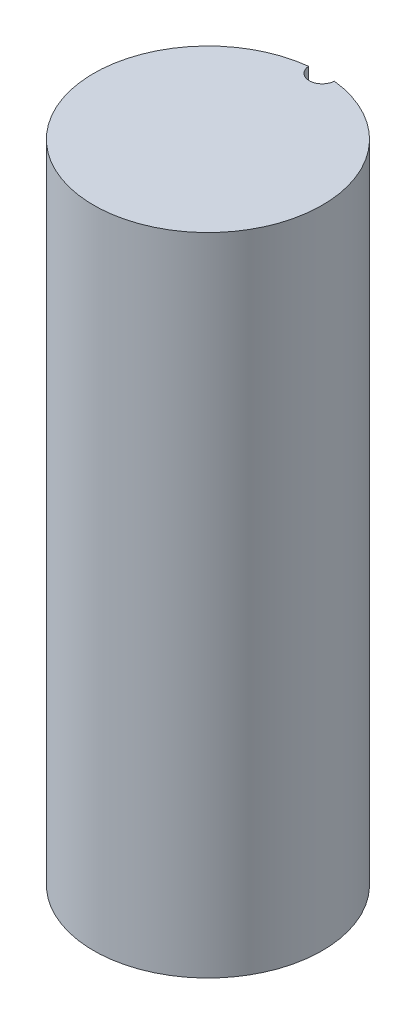
ISO-10303-21;
HEADER;
FILE_DESCRIPTION(('STEP AP214'),'2;1');
FILE_NAME('part.step','',(''),(''),'','','');
FILE_SCHEMA(('AUTOMOTIVE_DESIGN { 1 0 10303 214 1 1 1 1 }'));
ENDSEC;
DATA;
#1=APPLICATION_CONTEXT('core data for automotive mechanical design processes');
#2=APPLICATION_PROTOCOL_DEFINITION('international standard','automotive_design',2000,#1);
#3=PRODUCT_CONTEXT('',#1,'mechanical');
#4=PRODUCT('Part','Part','',(#3));
#5=PRODUCT_RELATED_PRODUCT_CATEGORY('part','',(#4));
#6=PRODUCT_DEFINITION_FORMATION('','',#4);
#7=PRODUCT_DEFINITION_CONTEXT('part definition',#1,'design');
#8=PRODUCT_DEFINITION('design','',#6,#7);
#9=PRODUCT_DEFINITION_SHAPE('','',#8);
#10=(LENGTH_UNIT() NAMED_UNIT(*) SI_UNIT(.MILLI.,.METRE.));
#11=(NAMED_UNIT(*) PLANE_ANGLE_UNIT() SI_UNIT($,.RADIAN.));
#12=(NAMED_UNIT(*) SI_UNIT($,.STERADIAN.) SOLID_ANGLE_UNIT());
#13=UNCERTAINTY_MEASURE_WITH_UNIT(LENGTH_MEASURE(1.E-05),#10,'distance_accuracy_value','');
#14=(GEOMETRIC_REPRESENTATION_CONTEXT(3) GLOBAL_UNCERTAINTY_ASSIGNED_CONTEXT((#13)) GLOBAL_UNIT_ASSIGNED_CONTEXT((#10,
#11,#12)) REPRESENTATION_CONTEXT('',''));
#15=CARTESIAN_POINT('',(0.,0.,0.));
#16=DIRECTION('',(0.,0.,1.));
#17=DIRECTION('',(1.,0.,0.));
#18=AXIS2_PLACEMENT_3D('',#15,#16,#17);
#19=CARTESIAN_POINT('',(0.,50.8,0.));
#20=DIRECTION('',(0.,-1.,0.));
#21=DIRECTION('',(0.,0.,-1.));
#22=AXIS2_PLACEMENT_3D('',#19,#20,#21);
#23=CYLINDRICAL_SURFACE('',#22,8.9916);
#24=CARTESIAN_POINT('',(0.,0.,0.));
#25=DIRECTION('',(0.,1.,0.));
#26=DIRECTION('',(0.,0.,1.));
#27=AXIS2_PLACEMENT_3D('',#24,#25,#26);
#28=CIRCLE('',#27,8.9916);
#29=CARTESIAN_POINT('',(-1.01437720315532,0.,-8.93419887005649));
#30=VERTEX_POINT('',#29);
#31=CARTESIAN_POINT('',(1.01437720315533,0.,-8.93419887005649));
#32=VERTEX_POINT('',#31);
#33=EDGE_CURVE('E74',#30,#32,#28,.T.);
#34=ORIENTED_EDGE('',*,*,#33,.T.);
#35=DIRECTION('',(0.,1.,0.));
#36=VECTOR('',#35,1.);
#37=CARTESIAN_POINT('',(1.01437720315532,25.4,-8.93419887005649));
#38=LINE('',#37,#36);
#39=CARTESIAN_POINT('',(1.01437720315532,50.8,-8.93419887005649));
#40=VERTEX_POINT('',#39);
#41=EDGE_CURVE('E59',#32,#40,#38,.T.);
#42=ORIENTED_EDGE('',*,*,#41,.T.);
#43=CARTESIAN_POINT('',(0.,50.8,0.));
#44=DIRECTION('',(0.,1.,0.));
#45=DIRECTION('',(0.,0.,1.));
#46=AXIS2_PLACEMENT_3D('',#43,#44,#45);
#47=CIRCLE('',#46,8.9916);
#48=CARTESIAN_POINT('',(-1.01437720315532,50.8,-8.93419887005649));
#49=VERTEX_POINT('',#48);
#50=EDGE_CURVE('E52',#49,#40,#47,.T.);
#51=ORIENTED_EDGE('',*,*,#50,.F.);
#52=DIRECTION('',(0.,1.,0.));
#53=VECTOR('',#52,1.);
#54=CARTESIAN_POINT('',(-1.01437720315532,25.4,-8.93419887005649));
#55=LINE('',#54,#53);
#56=EDGE_CURVE('E63',#49,#30,#55,.F.);
#57=ORIENTED_EDGE('',*,*,#56,.T.);
#58=EDGE_LOOP('',(#34,#42,#51,#57));
#59=FACE_BOUND('',#58,.T.);
#60=ADVANCED_FACE('F45',(#59),#23,.T.);
#61=CARTESIAN_POINT('',(0.,50.8,0.));
#62=DIRECTION('',(0.,1.,0.));
#63=DIRECTION('',(0.,0.,1.));
#64=AXIS2_PLACEMENT_3D('',#61,#62,#63);
#65=PLANE('',#64);
#66=CARTESIAN_POINT('',(0.,50.8,-8.9916));
#67=DIRECTION('',(0.,1.,0.));
#68=DIRECTION('',(0.,0.,1.));
#69=AXIS2_PLACEMENT_3D('',#66,#67,#68);
#70=CIRCLE('',#69,1.016);
#71=EDGE_CURVE('E76',#49,#40,#70,.T.);
#72=ORIENTED_EDGE('',*,*,#71,.F.);
#73=ORIENTED_EDGE('',*,*,#50,.T.);
#74=EDGE_LOOP('',(#72,#73));
#75=FACE_BOUND('',#74,.T.);
#76=ADVANCED_FACE('F83',(#75),#65,.T.);
#77=CARTESIAN_POINT('',(0.,0.,0.));
#78=DIRECTION('',(0.,1.,0.));
#79=DIRECTION('',(0.,0.,1.));
#80=AXIS2_PLACEMENT_3D('',#77,#78,#79);
#81=PLANE('',#80);
#82=ORIENTED_EDGE('',*,*,#33,.F.);
#83=CARTESIAN_POINT('',(0.,0.,-8.9916));
#84=DIRECTION('',(0.,1.,0.));
#85=DIRECTION('',(0.,0.,1.));
#86=AXIS2_PLACEMENT_3D('',#83,#84,#85);
#87=CIRCLE('',#86,1.016);
#88=EDGE_CURVE('E11',#30,#32,#87,.T.);
#89=ORIENTED_EDGE('',*,*,#88,.T.);
#90=EDGE_LOOP('',(#82,#89));
#91=FACE_BOUND('',#90,.T.);
#92=ADVANCED_FACE('F78',(#91),#81,.F.);
#93=CARTESIAN_POINT('',(0.,0.,-8.9916));
#94=DIRECTION('',(0.,1.,0.));
#95=DIRECTION('',(0.,0.,1.));
#96=AXIS2_PLACEMENT_3D('',#93,#94,#95);
#97=CYLINDRICAL_SURFACE('',#96,1.016);
#98=ORIENTED_EDGE('',*,*,#88,.F.);
#99=ORIENTED_EDGE('',*,*,#56,.F.);
#100=ORIENTED_EDGE('',*,*,#71,.T.);
#101=ORIENTED_EDGE('',*,*,#41,.F.);
#102=EDGE_LOOP('',(#98,#99,#100,#101));
#103=FACE_BOUND('',#102,.T.);
#104=ADVANCED_FACE('F68',(#103),#97,.F.);
#105=CLOSED_SHELL('',(#60,#76,#92,#104));
#106=MANIFOLD_SOLID_BREP('B2',#105);
#107=ADVANCED_BREP_SHAPE_REPRESENTATION('',(#18,#106),#14);
#108=SHAPE_DEFINITION_REPRESENTATION(#9,#107);
ENDSEC;
END-ISO-10303-21;
